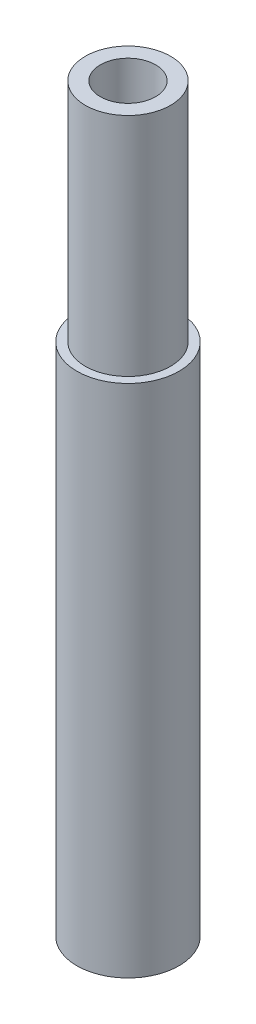
ISO-10303-21;
HEADER;
FILE_DESCRIPTION(('STEP AP214'),'2;1');
FILE_NAME('part.step','',(''),(''),'','','');
FILE_SCHEMA(('AUTOMOTIVE_DESIGN { 1 0 10303 214 1 1 1 1 }'));
ENDSEC;
DATA;
#1=APPLICATION_CONTEXT('core data for automotive mechanical design processes');
#2=APPLICATION_PROTOCOL_DEFINITION('international standard','automotive_design',2000,#1);
#3=PRODUCT_CONTEXT('',#1,'mechanical');
#4=PRODUCT('Part','Part','',(#3));
#5=PRODUCT_RELATED_PRODUCT_CATEGORY('part','',(#4));
#6=PRODUCT_DEFINITION_FORMATION('','',#4);
#7=PRODUCT_DEFINITION_CONTEXT('part definition',#1,'design');
#8=PRODUCT_DEFINITION('design','',#6,#7);
#9=PRODUCT_DEFINITION_SHAPE('','',#8);
#10=(LENGTH_UNIT() NAMED_UNIT(*) SI_UNIT(.MILLI.,.METRE.));
#11=(NAMED_UNIT(*) PLANE_ANGLE_UNIT() SI_UNIT($,.RADIAN.));
#12=(NAMED_UNIT(*) SI_UNIT($,.STERADIAN.) SOLID_ANGLE_UNIT());
#13=UNCERTAINTY_MEASURE_WITH_UNIT(LENGTH_MEASURE(1.E-05),#10,'distance_accuracy_value','');
#14=(GEOMETRIC_REPRESENTATION_CONTEXT(3) GLOBAL_UNCERTAINTY_ASSIGNED_CONTEXT((#13)) GLOBAL_UNIT_ASSIGNED_CONTEXT((#10,
#11,#12)) REPRESENTATION_CONTEXT('',''));
#15=CARTESIAN_POINT('',(0.,0.,0.));
#16=DIRECTION('',(0.,0.,1.));
#17=DIRECTION('',(1.,0.,0.));
#18=AXIS2_PLACEMENT_3D('',#15,#16,#17);
#19=CARTESIAN_POINT('',(0.,87.,0.));
#20=DIRECTION('',(0.,1.,0.));
#21=DIRECTION('',(0.,0.,1.));
#22=AXIS2_PLACEMENT_3D('',#19,#20,#21);
#23=PLANE('',#22);
#24=CARTESIAN_POINT('',(0.,87.,0.));
#25=DIRECTION('',(0.,1.,0.));
#26=DIRECTION('',(0.,0.,1.));
#27=AXIS2_PLACEMENT_3D('',#24,#25,#26);
#28=CIRCLE('',#27,3.25);
#29=CARTESIAN_POINT('',(0.,87.,3.25));
#30=VERTEX_POINT('',#29);
#31=EDGE_CURVE('E18',#30,#30,#28,.F.);
#32=ORIENTED_EDGE('',*,*,#31,.T.);
#33=EDGE_LOOP('',(#32));
#34=FACE_BOUND('',#33,.T.);
#35=CARTESIAN_POINT('',(0.,87.,0.));
#36=DIRECTION('',(0.,1.,0.));
#37=DIRECTION('',(0.,0.,1.));
#38=AXIS2_PLACEMENT_3D('',#35,#36,#37);
#39=CIRCLE('',#38,5.);
#40=CARTESIAN_POINT('',(0.,87.,5.));
#41=VERTEX_POINT('',#40);
#42=EDGE_CURVE('E34',#41,#41,#39,.F.);
#43=ORIENTED_EDGE('',*,*,#42,.F.);
#44=EDGE_LOOP('',(#43));
#45=FACE_BOUND('',#44,.T.);
#46=ADVANCED_FACE('F15',(#34,#45),#23,.T.);
#47=CARTESIAN_POINT('',(0.,0.,0.));
#48=DIRECTION('',(0.,1.,0.));
#49=DIRECTION('',(0.,0.,1.));
#50=AXIS2_PLACEMENT_3D('',#47,#48,#49);
#51=CYLINDRICAL_SURFACE('',#50,3.25);
#52=ORIENTED_EDGE('',*,*,#31,.F.);
#53=EDGE_LOOP('',(#52));
#54=FACE_BOUND('',#53,.T.);
#55=CARTESIAN_POINT('',(0.,0.,0.));
#56=DIRECTION('',(0.,1.,0.));
#57=DIRECTION('',(0.,0.,1.));
#58=AXIS2_PLACEMENT_3D('',#55,#56,#57);
#59=CIRCLE('',#58,3.25);
#60=CARTESIAN_POINT('',(0.,0.,3.25));
#61=VERTEX_POINT('',#60);
#62=EDGE_CURVE('E32',#61,#61,#59,.F.);
#63=ORIENTED_EDGE('',*,*,#62,.T.);
#64=EDGE_LOOP('',(#63));
#65=FACE_BOUND('',#64,.T.);
#66=ADVANCED_FACE('F43',(#54,#65),#51,.F.);
#67=CARTESIAN_POINT('',(0.,87.,0.));
#68=DIRECTION('',(0.,1.,0.));
#69=DIRECTION('',(0.,0.,1.));
#70=AXIS2_PLACEMENT_3D('',#67,#68,#69);
#71=CYLINDRICAL_SURFACE('',#70,5.);
#72=CARTESIAN_POINT('',(0.,60.46,0.));
#73=DIRECTION('',(0.,1.,0.));
#74=DIRECTION('',(0.,0.,1.));
#75=AXIS2_PLACEMENT_3D('',#72,#73,#74);
#76=CIRCLE('',#75,5.);
#77=CARTESIAN_POINT('',(0.,60.46,5.));
#78=VERTEX_POINT('',#77);
#79=EDGE_CURVE('E27',#78,#78,#76,.F.);
#80=ORIENTED_EDGE('',*,*,#79,.F.);
#81=EDGE_LOOP('',(#80));
#82=FACE_BOUND('',#81,.T.);
#83=ORIENTED_EDGE('',*,*,#42,.T.);
#84=EDGE_LOOP('',(#83));
#85=FACE_BOUND('',#84,.T.);
#86=ADVANCED_FACE('F46',(#82,#85),#71,.T.);
#87=CARTESIAN_POINT('',(0.,0.,0.));
#88=DIRECTION('',(0.,1.,0.));
#89=DIRECTION('',(0.,0.,1.));
#90=AXIS2_PLACEMENT_3D('',#87,#88,#89);
#91=PLANE('',#90);
#92=ORIENTED_EDGE('',*,*,#62,.F.);
#93=EDGE_LOOP('',(#92));
#94=FACE_BOUND('',#93,.T.);
#95=CARTESIAN_POINT('',(0.,0.,0.));
#96=DIRECTION('',(0.,1.,0.));
#97=DIRECTION('',(0.,0.,1.));
#98=AXIS2_PLACEMENT_3D('',#95,#96,#97);
#99=CIRCLE('',#98,6.);
#100=CARTESIAN_POINT('',(0.,0.,6.));
#101=VERTEX_POINT('',#100);
#102=EDGE_CURVE('E22',#101,#101,#99,.T.);
#103=ORIENTED_EDGE('',*,*,#102,.F.);
#104=EDGE_LOOP('',(#103));
#105=FACE_BOUND('',#104,.T.);
#106=ADVANCED_FACE('F49',(#94,#105),#91,.F.);
#107=CARTESIAN_POINT('',(0.,60.46,0.));
#108=DIRECTION('',(0.,1.,0.));
#109=DIRECTION('',(0.,0.,1.));
#110=AXIS2_PLACEMENT_3D('',#107,#108,#109);
#111=PLANE('',#110);
#112=ORIENTED_EDGE('',*,*,#79,.T.);
#113=EDGE_LOOP('',(#112));
#114=FACE_BOUND('',#113,.T.);
#115=CARTESIAN_POINT('',(0.,60.46,0.));
#116=DIRECTION('',(0.,1.,0.));
#117=DIRECTION('',(0.,0.,1.));
#118=AXIS2_PLACEMENT_3D('',#115,#116,#117);
#119=CIRCLE('',#118,6.);
#120=CARTESIAN_POINT('',(0.,60.46,6.));
#121=VERTEX_POINT('',#120);
#122=EDGE_CURVE('E10',#121,#121,#119,.F.);
#123=ORIENTED_EDGE('',*,*,#122,.F.);
#124=EDGE_LOOP('',(#123));
#125=FACE_BOUND('',#124,.T.);
#126=ADVANCED_FACE('F52',(#114,#125),#111,.T.);
#127=CARTESIAN_POINT('',(0.,0.,0.));
#128=DIRECTION('',(0.,1.,0.));
#129=DIRECTION('',(0.,0.,1.));
#130=AXIS2_PLACEMENT_3D('',#127,#128,#129);
#131=CYLINDRICAL_SURFACE('',#130,6.);
#132=ORIENTED_EDGE('',*,*,#102,.T.);
#133=EDGE_LOOP('',(#132));
#134=FACE_BOUND('',#133,.T.);
#135=ORIENTED_EDGE('',*,*,#122,.T.);
#136=EDGE_LOOP('',(#135));
#137=FACE_BOUND('',#136,.T.);
#138=ADVANCED_FACE('F56',(#134,#137),#131,.T.);
#139=CLOSED_SHELL('',(#46,#66,#86,#106,#126,#138));
#140=MANIFOLD_SOLID_BREP('B1',#139);
#141=ADVANCED_BREP_SHAPE_REPRESENTATION('',(#18,#140),#14);
#142=SHAPE_DEFINITION_REPRESENTATION(#9,#141);
ENDSEC;
END-ISO-10303-21;
